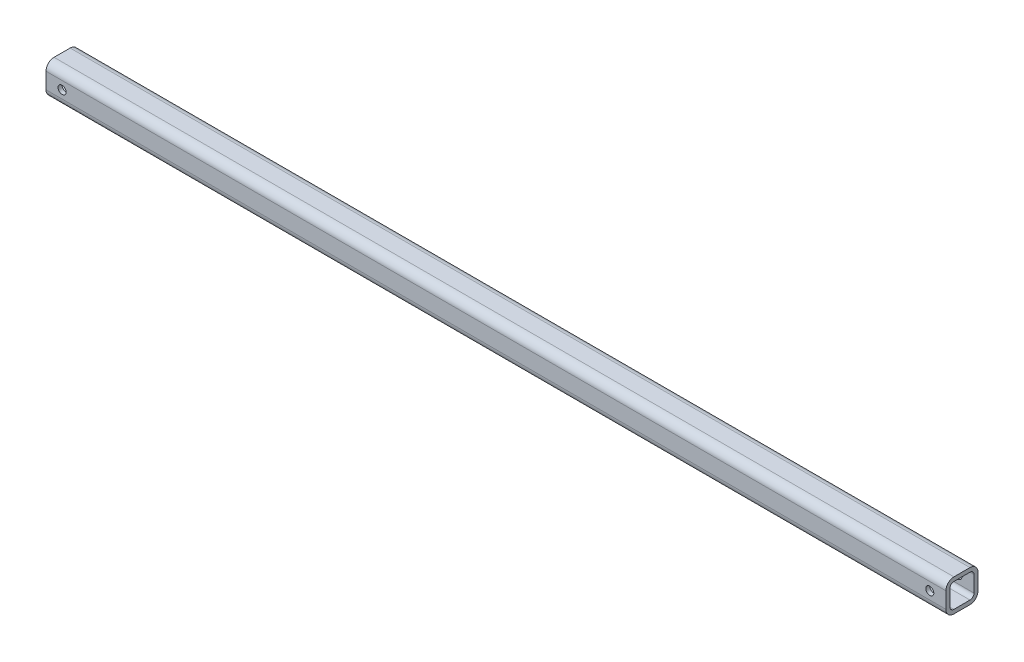
ISO-10303-21;
HEADER;
FILE_DESCRIPTION(('STEP AP214'),'2;1');
FILE_NAME('part.step','',(''),(''),'','','');
FILE_SCHEMA(('AUTOMOTIVE_DESIGN { 1 0 10303 214 1 1 1 1 }'));
ENDSEC;
DATA;
#1=APPLICATION_CONTEXT('core data for automotive mechanical design processes');
#2=APPLICATION_PROTOCOL_DEFINITION('international standard','automotive_design',2000,#1);
#3=PRODUCT_CONTEXT('',#1,'mechanical');
#4=PRODUCT('Part','Part','',(#3));
#5=PRODUCT_RELATED_PRODUCT_CATEGORY('part','',(#4));
#6=PRODUCT_DEFINITION_FORMATION('','',#4);
#7=PRODUCT_DEFINITION_CONTEXT('part definition',#1,'design');
#8=PRODUCT_DEFINITION('design','',#6,#7);
#9=PRODUCT_DEFINITION_SHAPE('','',#8);
#10=(LENGTH_UNIT() NAMED_UNIT(*) SI_UNIT(.MILLI.,.METRE.));
#11=(NAMED_UNIT(*) PLANE_ANGLE_UNIT() SI_UNIT($,.RADIAN.));
#12=(NAMED_UNIT(*) SI_UNIT($,.STERADIAN.) SOLID_ANGLE_UNIT());
#13=UNCERTAINTY_MEASURE_WITH_UNIT(LENGTH_MEASURE(1.E-05),#10,'distance_accuracy_value','');
#14=(GEOMETRIC_REPRESENTATION_CONTEXT(3) GLOBAL_UNCERTAINTY_ASSIGNED_CONTEXT((#13)) GLOBAL_UNIT_ASSIGNED_CONTEXT((#10,
#11,#12)) REPRESENTATION_CONTEXT('',''));
#15=CARTESIAN_POINT('',(0.,0.,0.));
#16=DIRECTION('',(0.,0.,1.));
#17=DIRECTION('',(1.,0.,0.));
#18=AXIS2_PLACEMENT_3D('',#15,#16,#17);
#19=CARTESIAN_POINT('',(680.806837606838,12.7,12.7));
#20=DIRECTION('',(-1.,0.,0.));
#21=DIRECTION('',(0.,0.,1.));
#22=AXIS2_PLACEMENT_3D('',#19,#20,#21);
#23=CYLINDRICAL_SURFACE('',#22,12.7);
#24=CARTESIAN_POINT('',(-741.593162393162,12.7,12.7));
#25=DIRECTION('',(1.,0.,0.));
#26=DIRECTION('',(0.,0.,-1.));
#27=AXIS2_PLACEMENT_3D('',#24,#25,#26);
#28=CIRCLE('',#27,12.7);
#29=CARTESIAN_POINT('',(-741.593162393162,25.4,12.7));
#30=VERTEX_POINT('',#29);
#31=CARTESIAN_POINT('',(-741.593162393162,12.7,25.4));
#32=VERTEX_POINT('',#31);
#33=EDGE_CURVE('E235',#30,#32,#28,.T.);
#34=ORIENTED_EDGE('',*,*,#33,.T.);
#35=DIRECTION('',(-1.,0.,0.));
#36=VECTOR('',#35,1.);
#37=CARTESIAN_POINT('',(680.806837606838,12.7,25.4));
#38=LINE('',#37,#36);
#39=CARTESIAN_POINT('',(680.806837606838,12.7,25.4));
#40=VERTEX_POINT('',#39);
#41=EDGE_CURVE('E12',#40,#32,#38,.T.);
#42=ORIENTED_EDGE('',*,*,#41,.F.);
#43=CARTESIAN_POINT('',(680.806837606838,12.7,12.7));
#44=DIRECTION('',(1.,0.,0.));
#45=DIRECTION('',(0.,0.,-1.));
#46=AXIS2_PLACEMENT_3D('',#43,#44,#45);
#47=CIRCLE('',#46,12.7);
#48=CARTESIAN_POINT('',(680.806837606838,25.4,12.7));
#49=VERTEX_POINT('',#48);
#50=EDGE_CURVE('E315',#49,#40,#47,.T.);
#51=ORIENTED_EDGE('',*,*,#50,.F.);
#52=DIRECTION('',(-1.,0.,0.));
#53=VECTOR('',#52,1.);
#54=CARTESIAN_POINT('',(680.806837606838,25.4,12.7));
#55=LINE('',#54,#53);
#56=EDGE_CURVE('E250',#49,#30,#55,.T.);
#57=ORIENTED_EDGE('',*,*,#56,.T.);
#58=EDGE_LOOP('',(#34,#42,#51,#57));
#59=FACE_BOUND('',#58,.T.);
#60=ADVANCED_FACE('F61',(#59),#23,.T.);
#61=CARTESIAN_POINT('',(680.806837606838,12.7,25.4));
#62=DIRECTION('',(0.,0.,-1.));
#63=DIRECTION('',(-1.,0.,0.));
#64=AXIS2_PLACEMENT_3D('',#61,#62,#63);
#65=PLANE('',#64);
#66=CARTESIAN_POINT('',(655.406837606838,0.,25.4));
#67=DIRECTION('',(0.,0.,1.));
#68=DIRECTION('',(-1.,0.,0.));
#69=AXIS2_PLACEMENT_3D('',#66,#67,#68);
#70=CIRCLE('',#69,6.34999999999994);
#71=CARTESIAN_POINT('',(649.056837606838,0.,25.4));
#72=VERTEX_POINT('',#71);
#73=EDGE_CURVE('E435',#72,#72,#70,.T.);
#74=ORIENTED_EDGE('',*,*,#73,.F.);
#75=EDGE_LOOP('',(#74));
#76=FACE_BOUND('',#75,.T.);
#77=CARTESIAN_POINT('',(-716.193162393162,0.,25.4));
#78=DIRECTION('',(0.,0.,1.));
#79=DIRECTION('',(1.,0.,0.));
#80=AXIS2_PLACEMENT_3D('',#77,#78,#79);
#81=CIRCLE('',#80,6.34999999999994);
#82=CARTESIAN_POINT('',(-709.843162393162,0.,25.4));
#83=VERTEX_POINT('',#82);
#84=EDGE_CURVE('E283',#83,#83,#81,.T.);
#85=ORIENTED_EDGE('',*,*,#84,.F.);
#86=EDGE_LOOP('',(#85));
#87=FACE_BOUND('',#86,.T.);
#88=DIRECTION('',(0.,-1.,0.));
#89=VECTOR('',#88,1.);
#90=CARTESIAN_POINT('',(-741.593162393162,12.7,25.4));
#91=LINE('',#90,#89);
#92=CARTESIAN_POINT('',(-741.593162393162,-12.7,25.4));
#93=VERTEX_POINT('',#92);
#94=EDGE_CURVE('E238',#32,#93,#91,.T.);
#95=ORIENTED_EDGE('',*,*,#94,.T.);
#96=DIRECTION('',(-1.,0.,0.));
#97=VECTOR('',#96,1.);
#98=CARTESIAN_POINT('',(680.806837606838,-12.7,25.4));
#99=LINE('',#98,#97);
#100=CARTESIAN_POINT('',(680.806837606838,-12.7,25.4));
#101=VERTEX_POINT('',#100);
#102=EDGE_CURVE('E71',#101,#93,#99,.T.);
#103=ORIENTED_EDGE('',*,*,#102,.F.);
#104=DIRECTION('',(0.,-1.,0.));
#105=VECTOR('',#104,1.);
#106=CARTESIAN_POINT('',(680.806837606838,12.7,25.4));
#107=LINE('',#106,#105);
#108=EDGE_CURVE('E317',#40,#101,#107,.T.);
#109=ORIENTED_EDGE('',*,*,#108,.F.);
#110=ORIENTED_EDGE('',*,*,#41,.T.);
#111=EDGE_LOOP('',(#95,#103,#109,#110));
#112=FACE_BOUND('',#111,.T.);
#113=ADVANCED_FACE('F355',(#76,#87,#112),#65,.F.);
#114=CARTESIAN_POINT('',(680.806837606838,-12.7,12.7));
#115=DIRECTION('',(-1.,0.,0.));
#116=DIRECTION('',(0.,0.,1.));
#117=AXIS2_PLACEMENT_3D('',#114,#115,#116);
#118=CYLINDRICAL_SURFACE('',#117,12.7);
#119=CARTESIAN_POINT('',(-741.593162393162,-12.7,12.7));
#120=DIRECTION('',(1.,0.,0.));
#121=DIRECTION('',(0.,0.,-1.));
#122=AXIS2_PLACEMENT_3D('',#119,#120,#121);
#123=CIRCLE('',#122,12.7);
#124=CARTESIAN_POINT('',(-741.593162393162,-25.4,12.7));
#125=VERTEX_POINT('',#124);
#126=EDGE_CURVE('E240',#93,#125,#123,.T.);
#127=ORIENTED_EDGE('',*,*,#126,.T.);
#128=DIRECTION('',(-1.,0.,0.));
#129=VECTOR('',#128,1.);
#130=CARTESIAN_POINT('',(680.806837606838,-25.4,12.7));
#131=LINE('',#130,#129);
#132=CARTESIAN_POINT('',(680.806837606838,-25.4,12.7));
#133=VERTEX_POINT('',#132);
#134=EDGE_CURVE('E257',#133,#125,#131,.T.);
#135=ORIENTED_EDGE('',*,*,#134,.F.);
#136=CARTESIAN_POINT('',(680.806837606838,-12.7,12.7));
#137=DIRECTION('',(1.,0.,0.));
#138=DIRECTION('',(0.,0.,-1.));
#139=AXIS2_PLACEMENT_3D('',#136,#137,#138);
#140=CIRCLE('',#139,12.7);
#141=EDGE_CURVE('E319',#101,#133,#140,.T.);
#142=ORIENTED_EDGE('',*,*,#141,.F.);
#143=ORIENTED_EDGE('',*,*,#102,.T.);
#144=EDGE_LOOP('',(#127,#135,#142,#143));
#145=FACE_BOUND('',#144,.T.);
#146=ADVANCED_FACE('F360',(#145),#118,.T.);
#147=CARTESIAN_POINT('',(680.806837606838,-25.4,-12.7));
#148=DIRECTION('',(0.,1.,0.));
#149=DIRECTION('',(0.,0.,1.));
#150=AXIS2_PLACEMENT_3D('',#147,#148,#149);
#151=PLANE('',#150);
#152=DIRECTION('',(0.,0.,-1.));
#153=VECTOR('',#152,1.);
#154=CARTESIAN_POINT('',(-741.593162393162,-25.4,-12.7));
#155=LINE('',#154,#153);
#156=CARTESIAN_POINT('',(-741.593162393162,-25.4,-12.7));
#157=VERTEX_POINT('',#156);
#158=EDGE_CURVE('E242',#125,#157,#155,.T.);
#159=ORIENTED_EDGE('',*,*,#158,.T.);
#160=DIRECTION('',(-1.,0.,0.));
#161=VECTOR('',#160,1.);
#162=CARTESIAN_POINT('',(680.806837606838,-25.4,-12.7));
#163=LINE('',#162,#161);
#164=CARTESIAN_POINT('',(680.806837606838,-25.4,-12.7));
#165=VERTEX_POINT('',#164);
#166=EDGE_CURVE('E254',#165,#157,#163,.T.);
#167=ORIENTED_EDGE('',*,*,#166,.F.);
#168=DIRECTION('',(0.,0.,-1.));
#169=VECTOR('',#168,1.);
#170=CARTESIAN_POINT('',(680.806837606838,-25.4,-12.7));
#171=LINE('',#170,#169);
#172=EDGE_CURVE('E321',#133,#165,#171,.T.);
#173=ORIENTED_EDGE('',*,*,#172,.F.);
#174=ORIENTED_EDGE('',*,*,#134,.T.);
#175=EDGE_LOOP('',(#159,#167,#173,#174));
#176=FACE_BOUND('',#175,.T.);
#177=ADVANCED_FACE('F327',(#176),#151,.F.);
#178=CARTESIAN_POINT('',(680.806837606838,-12.7,-12.7));
#179=DIRECTION('',(-1.,0.,0.));
#180=DIRECTION('',(0.,0.,1.));
#181=AXIS2_PLACEMENT_3D('',#178,#179,#180);
#182=CYLINDRICAL_SURFACE('',#181,12.7);
#183=CARTESIAN_POINT('',(-741.593162393162,-12.7,-12.7));
#184=DIRECTION('',(1.,0.,0.));
#185=DIRECTION('',(0.,0.,-1.));
#186=AXIS2_PLACEMENT_3D('',#183,#184,#185);
#187=CIRCLE('',#186,12.7);
#188=CARTESIAN_POINT('',(-741.593162393162,-12.7,-25.4));
#189=VERTEX_POINT('',#188);
#190=EDGE_CURVE('E244',#157,#189,#187,.T.);
#191=ORIENTED_EDGE('',*,*,#190,.T.);
#192=DIRECTION('',(-1.,0.,0.));
#193=VECTOR('',#192,1.);
#194=CARTESIAN_POINT('',(680.806837606838,-12.7,-25.4));
#195=LINE('',#194,#193);
#196=CARTESIAN_POINT('',(680.806837606838,-12.7,-25.4));
#197=VERTEX_POINT('',#196);
#198=EDGE_CURVE('E201',#197,#189,#195,.T.);
#199=ORIENTED_EDGE('',*,*,#198,.F.);
#200=CARTESIAN_POINT('',(680.806837606838,-12.7,-12.7));
#201=DIRECTION('',(1.,0.,0.));
#202=DIRECTION('',(0.,0.,-1.));
#203=AXIS2_PLACEMENT_3D('',#200,#201,#202);
#204=CIRCLE('',#203,12.7);
#205=EDGE_CURVE('E192',#165,#197,#204,.T.);
#206=ORIENTED_EDGE('',*,*,#205,.F.);
#207=ORIENTED_EDGE('',*,*,#166,.T.);
#208=EDGE_LOOP('',(#191,#199,#206,#207));
#209=FACE_BOUND('',#208,.T.);
#210=ADVANCED_FACE('F331',(#209),#182,.T.);
#211=CARTESIAN_POINT('',(680.806837606838,-12.7,-25.4));
#212=DIRECTION('',(0.,0.,1.));
#213=DIRECTION('',(1.,0.,0.));
#214=AXIS2_PLACEMENT_3D('',#211,#212,#213);
#215=PLANE('',#214);
#216=CARTESIAN_POINT('',(655.406837606838,0.,-25.4));
#217=DIRECTION('',(0.,0.,1.));
#218=DIRECTION('',(-1.,0.,0.));
#219=AXIS2_PLACEMENT_3D('',#216,#217,#218);
#220=CIRCLE('',#219,6.34999999999994);
#221=CARTESIAN_POINT('',(649.056837606838,0.,-25.4));
#222=VERTEX_POINT('',#221);
#223=EDGE_CURVE('E433',#222,#222,#220,.T.);
#224=ORIENTED_EDGE('',*,*,#223,.T.);
#225=EDGE_LOOP('',(#224));
#226=FACE_BOUND('',#225,.T.);
#227=CARTESIAN_POINT('',(-716.193162393162,0.,-25.4));
#228=DIRECTION('',(0.,0.,1.));
#229=DIRECTION('',(1.,0.,0.));
#230=AXIS2_PLACEMENT_3D('',#227,#228,#229);
#231=CIRCLE('',#230,6.34999999999994);
#232=CARTESIAN_POINT('',(-709.843162393162,0.,-25.4));
#233=VERTEX_POINT('',#232);
#234=EDGE_CURVE('E277',#233,#233,#231,.T.);
#235=ORIENTED_EDGE('',*,*,#234,.T.);
#236=EDGE_LOOP('',(#235));
#237=FACE_BOUND('',#236,.T.);
#238=DIRECTION('',(0.,1.,0.));
#239=VECTOR('',#238,1.);
#240=CARTESIAN_POINT('',(-741.593162393162,-12.7,-25.4));
#241=LINE('',#240,#239);
#242=CARTESIAN_POINT('',(-741.593162393162,12.7,-25.4));
#243=VERTEX_POINT('',#242);
#244=EDGE_CURVE('E200',#189,#243,#241,.T.);
#245=ORIENTED_EDGE('',*,*,#244,.T.);
#246=DIRECTION('',(-1.,0.,0.));
#247=VECTOR('',#246,1.);
#248=CARTESIAN_POINT('',(680.806837606838,12.7,-25.4));
#249=LINE('',#248,#247);
#250=CARTESIAN_POINT('',(680.806837606838,12.7,-25.4));
#251=VERTEX_POINT('',#250);
#252=EDGE_CURVE('E197',#251,#243,#249,.T.);
#253=ORIENTED_EDGE('',*,*,#252,.F.);
#254=DIRECTION('',(0.,1.,0.));
#255=VECTOR('',#254,1.);
#256=CARTESIAN_POINT('',(680.806837606838,-12.7,-25.4));
#257=LINE('',#256,#255);
#258=EDGE_CURVE('E186',#197,#251,#257,.T.);
#259=ORIENTED_EDGE('',*,*,#258,.F.);
#260=ORIENTED_EDGE('',*,*,#198,.T.);
#261=EDGE_LOOP('',(#245,#253,#259,#260));
#262=FACE_BOUND('',#261,.T.);
#263=ADVANCED_FACE('F198',(#226,#237,#262),#215,.F.);
#264=CARTESIAN_POINT('',(680.806837606838,12.7,-12.7));
#265=DIRECTION('',(-1.,0.,0.));
#266=DIRECTION('',(0.,0.,1.));
#267=AXIS2_PLACEMENT_3D('',#264,#265,#266);
#268=CYLINDRICAL_SURFACE('',#267,12.7);
#269=CARTESIAN_POINT('',(-741.593162393162,12.7,-12.7));
#270=DIRECTION('',(1.,0.,0.));
#271=DIRECTION('',(0.,0.,-1.));
#272=AXIS2_PLACEMENT_3D('',#269,#270,#271);
#273=CIRCLE('',#272,12.7);
#274=CARTESIAN_POINT('',(-741.593162393162,25.4,-12.7));
#275=VERTEX_POINT('',#274);
#276=EDGE_CURVE('E133',#243,#275,#273,.T.);
#277=ORIENTED_EDGE('',*,*,#276,.T.);
#278=DIRECTION('',(-1.,0.,0.));
#279=VECTOR('',#278,1.);
#280=CARTESIAN_POINT('',(680.806837606838,25.4,-12.7));
#281=LINE('',#280,#279);
#282=CARTESIAN_POINT('',(680.806837606838,25.4,-12.7));
#283=VERTEX_POINT('',#282);
#284=EDGE_CURVE('E202',#283,#275,#281,.T.);
#285=ORIENTED_EDGE('',*,*,#284,.F.);
#286=CARTESIAN_POINT('',(680.806837606838,12.7,-12.7));
#287=DIRECTION('',(1.,0.,0.));
#288=DIRECTION('',(0.,0.,-1.));
#289=AXIS2_PLACEMENT_3D('',#286,#287,#288);
#290=CIRCLE('',#289,12.7);
#291=EDGE_CURVE('E190',#251,#283,#290,.T.);
#292=ORIENTED_EDGE('',*,*,#291,.F.);
#293=ORIENTED_EDGE('',*,*,#252,.T.);
#294=EDGE_LOOP('',(#277,#285,#292,#293));
#295=FACE_BOUND('',#294,.T.);
#296=ADVANCED_FACE('F204',(#295),#268,.T.);
#297=CARTESIAN_POINT('',(680.806837606838,-12.7,12.7));
#298=DIRECTION('',(-1.,0.,0.));
#299=DIRECTION('',(0.,0.,1.));
#300=AXIS2_PLACEMENT_3D('',#297,#298,#299);
#301=CYLINDRICAL_SURFACE('',#300,6.35);
#302=CARTESIAN_POINT('',(-741.593162393162,-12.7,12.7));
#303=DIRECTION('',(1.,0.,0.));
#304=DIRECTION('',(0.,0.,-1.));
#305=AXIS2_PLACEMENT_3D('',#302,#303,#304);
#306=CIRCLE('',#305,6.35);
#307=CARTESIAN_POINT('',(-741.593162393162,-12.7,19.05));
#308=VERTEX_POINT('',#307);
#309=CARTESIAN_POINT('',(-741.593162393162,-19.05,12.7));
#310=VERTEX_POINT('',#309);
#311=EDGE_CURVE('E210',#308,#310,#306,.T.);
#312=ORIENTED_EDGE('',*,*,#311,.F.);
#313=DIRECTION('',(-1.,0.,0.));
#314=VECTOR('',#313,1.);
#315=CARTESIAN_POINT('',(680.806837606838,-12.7,19.05));
#316=LINE('',#315,#314);
#317=CARTESIAN_POINT('',(680.806837606838,-12.7,19.05));
#318=VERTEX_POINT('',#317);
#319=EDGE_CURVE('E147',#318,#308,#316,.T.);
#320=ORIENTED_EDGE('',*,*,#319,.F.);
#321=CARTESIAN_POINT('',(680.806837606838,-12.7,12.7));
#322=DIRECTION('',(1.,0.,0.));
#323=DIRECTION('',(0.,0.,-1.));
#324=AXIS2_PLACEMENT_3D('',#321,#322,#323);
#325=CIRCLE('',#324,6.35);
#326=CARTESIAN_POINT('',(680.806837606838,-19.05,12.7));
#327=VERTEX_POINT('',#326);
#328=EDGE_CURVE('E249',#318,#327,#325,.T.);
#329=ORIENTED_EDGE('',*,*,#328,.T.);
#330=DIRECTION('',(-1.,0.,0.));
#331=VECTOR('',#330,1.);
#332=CARTESIAN_POINT('',(680.806837606838,-19.05,12.7));
#333=LINE('',#332,#331);
#334=EDGE_CURVE('E206',#327,#310,#333,.T.);
#335=ORIENTED_EDGE('',*,*,#334,.T.);
#336=EDGE_LOOP('',(#312,#320,#329,#335));
#337=FACE_BOUND('',#336,.T.);
#338=ADVANCED_FACE('F63',(#337),#301,.F.);
#339=CARTESIAN_POINT('',(680.806837606838,12.7,19.05));
#340=DIRECTION('',(0.,0.,-1.));
#341=DIRECTION('',(-1.,0.,0.));
#342=AXIS2_PLACEMENT_3D('',#339,#340,#341);
#343=PLANE('',#342);
#344=CARTESIAN_POINT('',(655.406837606838,0.,19.05));
#345=DIRECTION('',(0.,0.,-1.));
#346=DIRECTION('',(-1.,0.,0.));
#347=AXIS2_PLACEMENT_3D('',#344,#345,#346);
#348=CIRCLE('',#347,6.34999999999994);
#349=CARTESIAN_POINT('',(649.056837606838,0.,19.05));
#350=VERTEX_POINT('',#349);
#351=EDGE_CURVE('E288',#350,#350,#348,.T.);
#352=ORIENTED_EDGE('',*,*,#351,.F.);
#353=EDGE_LOOP('',(#352));
#354=FACE_BOUND('',#353,.T.);
#355=CARTESIAN_POINT('',(-716.193162393162,0.,19.05));
#356=DIRECTION('',(0.,0.,-1.));
#357=DIRECTION('',(-1.,0.,0.));
#358=AXIS2_PLACEMENT_3D('',#355,#356,#357);
#359=CIRCLE('',#358,6.34999999999994);
#360=CARTESIAN_POINT('',(-722.543162393162,0.,19.05));
#361=VERTEX_POINT('',#360);
#362=EDGE_CURVE('E214',#361,#361,#359,.T.);
#363=ORIENTED_EDGE('',*,*,#362,.F.);
#364=EDGE_LOOP('',(#363));
#365=FACE_BOUND('',#364,.T.);
#366=DIRECTION('',(0.,-1.,0.));
#367=VECTOR('',#366,1.);
#368=CARTESIAN_POINT('',(-741.593162393162,12.7,19.05));
#369=LINE('',#368,#367);
#370=CARTESIAN_POINT('',(-741.593162393162,12.7,19.05));
#371=VERTEX_POINT('',#370);
#372=EDGE_CURVE('E213',#371,#308,#369,.T.);
#373=ORIENTED_EDGE('',*,*,#372,.F.);
#374=DIRECTION('',(-1.,0.,0.));
#375=VECTOR('',#374,1.);
#376=CARTESIAN_POINT('',(680.806837606838,12.7,19.05));
#377=LINE('',#376,#375);
#378=CARTESIAN_POINT('',(680.806837606838,12.7,19.05));
#379=VERTEX_POINT('',#378);
#380=EDGE_CURVE('E273',#379,#371,#377,.T.);
#381=ORIENTED_EDGE('',*,*,#380,.F.);
#382=DIRECTION('',(0.,-1.,0.));
#383=VECTOR('',#382,1.);
#384=CARTESIAN_POINT('',(680.806837606838,12.7,19.05));
#385=LINE('',#384,#383);
#386=EDGE_CURVE('E294',#379,#318,#385,.T.);
#387=ORIENTED_EDGE('',*,*,#386,.T.);
#388=ORIENTED_EDGE('',*,*,#319,.T.);
#389=EDGE_LOOP('',(#373,#381,#387,#388));
#390=FACE_BOUND('',#389,.T.);
#391=ADVANCED_FACE('F382',(#354,#365,#390),#343,.T.);
#392=CARTESIAN_POINT('',(680.806837606838,12.7,12.7));
#393=DIRECTION('',(-1.,0.,0.));
#394=DIRECTION('',(0.,0.,1.));
#395=AXIS2_PLACEMENT_3D('',#392,#393,#394);
#396=CYLINDRICAL_SURFACE('',#395,6.35);
#397=CARTESIAN_POINT('',(-741.593162393162,12.7,12.7));
#398=DIRECTION('',(1.,0.,0.));
#399=DIRECTION('',(0.,0.,-1.));
#400=AXIS2_PLACEMENT_3D('',#397,#398,#399);
#401=CIRCLE('',#400,6.35);
#402=CARTESIAN_POINT('',(-741.593162393162,19.05,12.7));
#403=VERTEX_POINT('',#402);
#404=EDGE_CURVE('E217',#403,#371,#401,.T.);
#405=ORIENTED_EDGE('',*,*,#404,.F.);
#406=DIRECTION('',(-1.,0.,0.));
#407=VECTOR('',#406,1.);
#408=CARTESIAN_POINT('',(680.806837606838,19.05,12.7));
#409=LINE('',#408,#407);
#410=CARTESIAN_POINT('',(680.806837606838,19.05,12.7));
#411=VERTEX_POINT('',#410);
#412=EDGE_CURVE('E271',#411,#403,#409,.T.);
#413=ORIENTED_EDGE('',*,*,#412,.F.);
#414=CARTESIAN_POINT('',(680.806837606838,12.7,12.7));
#415=DIRECTION('',(1.,0.,0.));
#416=DIRECTION('',(0.,0.,-1.));
#417=AXIS2_PLACEMENT_3D('',#414,#415,#416);
#418=CIRCLE('',#417,6.35);
#419=EDGE_CURVE('E297',#411,#379,#418,.T.);
#420=ORIENTED_EDGE('',*,*,#419,.T.);
#421=ORIENTED_EDGE('',*,*,#380,.T.);
#422=EDGE_LOOP('',(#405,#413,#420,#421));
#423=FACE_BOUND('',#422,.T.);
#424=ADVANCED_FACE('F379',(#423),#396,.F.);
#425=CARTESIAN_POINT('',(680.806837606838,19.05,12.7));
#426=DIRECTION('',(0.,-1.,0.));
#427=DIRECTION('',(0.,0.,-1.));
#428=AXIS2_PLACEMENT_3D('',#425,#426,#427);
#429=PLANE('',#428);
#430=DIRECTION('',(0.,0.,1.));
#431=VECTOR('',#430,1.);
#432=CARTESIAN_POINT('',(-741.593162393162,19.05,12.7));
#433=LINE('',#432,#431);
#434=CARTESIAN_POINT('',(-741.593162393162,19.05,-12.7));
#435=VERTEX_POINT('',#434);
#436=EDGE_CURVE('E220',#435,#403,#433,.T.);
#437=ORIENTED_EDGE('',*,*,#436,.F.);
#438=DIRECTION('',(-1.,0.,0.));
#439=VECTOR('',#438,1.);
#440=CARTESIAN_POINT('',(680.806837606838,19.05,-12.7));
#441=LINE('',#440,#439);
#442=CARTESIAN_POINT('',(680.806837606838,19.05,-12.7));
#443=VERTEX_POINT('',#442);
#444=EDGE_CURVE('E269',#443,#435,#441,.T.);
#445=ORIENTED_EDGE('',*,*,#444,.F.);
#446=DIRECTION('',(0.,0.,1.));
#447=VECTOR('',#446,1.);
#448=CARTESIAN_POINT('',(680.806837606838,19.05,12.7));
#449=LINE('',#448,#447);
#450=EDGE_CURVE('E300',#443,#411,#449,.T.);
#451=ORIENTED_EDGE('',*,*,#450,.T.);
#452=ORIENTED_EDGE('',*,*,#412,.T.);
#453=EDGE_LOOP('',(#437,#445,#451,#452));
#454=FACE_BOUND('',#453,.T.);
#455=ADVANCED_FACE('F375',(#454),#429,.T.);
#456=CARTESIAN_POINT('',(680.806837606838,12.7,-12.7));
#457=DIRECTION('',(-1.,0.,0.));
#458=DIRECTION('',(0.,0.,1.));
#459=AXIS2_PLACEMENT_3D('',#456,#457,#458);
#460=CYLINDRICAL_SURFACE('',#459,6.35);
#461=CARTESIAN_POINT('',(-741.593162393162,12.7,-12.7));
#462=DIRECTION('',(1.,0.,0.));
#463=DIRECTION('',(0.,0.,-1.));
#464=AXIS2_PLACEMENT_3D('',#461,#462,#463);
#465=CIRCLE('',#464,6.35);
#466=CARTESIAN_POINT('',(-741.593162393162,12.7,-19.05));
#467=VERTEX_POINT('',#466);
#468=EDGE_CURVE('E223',#467,#435,#465,.T.);
#469=ORIENTED_EDGE('',*,*,#468,.F.);
#470=DIRECTION('',(-1.,0.,0.));
#471=VECTOR('',#470,1.);
#472=CARTESIAN_POINT('',(680.806837606838,12.7,-19.05));
#473=LINE('',#472,#471);
#474=CARTESIAN_POINT('',(680.806837606838,12.7,-19.05));
#475=VERTEX_POINT('',#474);
#476=EDGE_CURVE('E267',#475,#467,#473,.T.);
#477=ORIENTED_EDGE('',*,*,#476,.F.);
#478=CARTESIAN_POINT('',(680.806837606838,12.7,-12.7));
#479=DIRECTION('',(1.,0.,0.));
#480=DIRECTION('',(0.,0.,-1.));
#481=AXIS2_PLACEMENT_3D('',#478,#479,#480);
#482=CIRCLE('',#481,6.35);
#483=EDGE_CURVE('E303',#475,#443,#482,.T.);
#484=ORIENTED_EDGE('',*,*,#483,.T.);
#485=ORIENTED_EDGE('',*,*,#444,.T.);
#486=EDGE_LOOP('',(#469,#477,#484,#485));
#487=FACE_BOUND('',#486,.T.);
#488=ADVANCED_FACE('F371',(#487),#460,.F.);
#489=CARTESIAN_POINT('',(680.806837606838,-12.7,-19.05));
#490=DIRECTION('',(0.,0.,1.));
#491=DIRECTION('',(1.,0.,0.));
#492=AXIS2_PLACEMENT_3D('',#489,#490,#491);
#493=PLANE('',#492);
#494=CARTESIAN_POINT('',(655.406837606838,0.,-19.05));
#495=DIRECTION('',(0.,0.,1.));
#496=DIRECTION('',(1.,0.,0.));
#497=AXIS2_PLACEMENT_3D('',#494,#495,#496);
#498=CIRCLE('',#497,6.34999999999994);
#499=CARTESIAN_POINT('',(661.756837606838,0.,-19.05));
#500=VERTEX_POINT('',#499);
#501=EDGE_CURVE('E65',#500,#500,#498,.T.);
#502=ORIENTED_EDGE('',*,*,#501,.F.);
#503=EDGE_LOOP('',(#502));
#504=FACE_BOUND('',#503,.T.);
#505=CARTESIAN_POINT('',(-716.193162393162,0.,-19.05));
#506=DIRECTION('',(0.,0.,1.));
#507=DIRECTION('',(1.,0.,0.));
#508=AXIS2_PLACEMENT_3D('',#505,#506,#507);
#509=CIRCLE('',#508,6.34999999999994);
#510=CARTESIAN_POINT('',(-709.843162393162,0.,-19.05));
#511=VERTEX_POINT('',#510);
#512=EDGE_CURVE('E275',#511,#511,#509,.T.);
#513=ORIENTED_EDGE('',*,*,#512,.F.);
#514=EDGE_LOOP('',(#513));
#515=FACE_BOUND('',#514,.T.);
#516=DIRECTION('',(0.,1.,0.));
#517=VECTOR('',#516,1.);
#518=CARTESIAN_POINT('',(-741.593162393162,-12.7,-19.05));
#519=LINE('',#518,#517);
#520=CARTESIAN_POINT('',(-741.593162393162,-12.7,-19.05));
#521=VERTEX_POINT('',#520);
#522=EDGE_CURVE('E226',#521,#467,#519,.T.);
#523=ORIENTED_EDGE('',*,*,#522,.F.);
#524=DIRECTION('',(-1.,0.,0.));
#525=VECTOR('',#524,1.);
#526=CARTESIAN_POINT('',(680.806837606838,-12.7,-19.05));
#527=LINE('',#526,#525);
#528=CARTESIAN_POINT('',(680.806837606838,-12.7,-19.05));
#529=VERTEX_POINT('',#528);
#530=EDGE_CURVE('E265',#529,#521,#527,.T.);
#531=ORIENTED_EDGE('',*,*,#530,.F.);
#532=DIRECTION('',(0.,1.,0.));
#533=VECTOR('',#532,1.);
#534=CARTESIAN_POINT('',(680.806837606838,-12.7,-19.05));
#535=LINE('',#534,#533);
#536=EDGE_CURVE('E306',#529,#475,#535,.T.);
#537=ORIENTED_EDGE('',*,*,#536,.T.);
#538=ORIENTED_EDGE('',*,*,#476,.T.);
#539=EDGE_LOOP('',(#523,#531,#537,#538));
#540=FACE_BOUND('',#539,.T.);
#541=ADVANCED_FACE('F367',(#504,#515,#540),#493,.T.);
#542=CARTESIAN_POINT('',(680.806837606838,-12.7,-12.7));
#543=DIRECTION('',(-1.,0.,0.));
#544=DIRECTION('',(0.,0.,1.));
#545=AXIS2_PLACEMENT_3D('',#542,#543,#544);
#546=CYLINDRICAL_SURFACE('',#545,6.35);
#547=CARTESIAN_POINT('',(-741.593162393162,-12.7,-12.7));
#548=DIRECTION('',(1.,0.,0.));
#549=DIRECTION('',(0.,0.,-1.));
#550=AXIS2_PLACEMENT_3D('',#547,#548,#549);
#551=CIRCLE('',#550,6.35);
#552=CARTESIAN_POINT('',(-741.593162393162,-19.05,-12.7));
#553=VERTEX_POINT('',#552);
#554=EDGE_CURVE('E229',#553,#521,#551,.T.);
#555=ORIENTED_EDGE('',*,*,#554,.F.);
#556=DIRECTION('',(-1.,0.,0.));
#557=VECTOR('',#556,1.);
#558=CARTESIAN_POINT('',(680.806837606838,-19.05,-12.7));
#559=LINE('',#558,#557);
#560=CARTESIAN_POINT('',(680.806837606838,-19.05,-12.7));
#561=VERTEX_POINT('',#560);
#562=EDGE_CURVE('E263',#561,#553,#559,.T.);
#563=ORIENTED_EDGE('',*,*,#562,.F.);
#564=CARTESIAN_POINT('',(680.806837606838,-12.7,-12.7));
#565=DIRECTION('',(1.,0.,0.));
#566=DIRECTION('',(0.,0.,-1.));
#567=AXIS2_PLACEMENT_3D('',#564,#565,#566);
#568=CIRCLE('',#567,6.35);
#569=EDGE_CURVE('E309',#561,#529,#568,.T.);
#570=ORIENTED_EDGE('',*,*,#569,.T.);
#571=ORIENTED_EDGE('',*,*,#530,.T.);
#572=EDGE_LOOP('',(#555,#563,#570,#571));
#573=FACE_BOUND('',#572,.T.);
#574=ADVANCED_FACE('F349',(#573),#546,.F.);
#575=CARTESIAN_POINT('',(680.806837606838,-19.05,-12.7));
#576=DIRECTION('',(0.,1.,0.));
#577=DIRECTION('',(0.,0.,1.));
#578=AXIS2_PLACEMENT_3D('',#575,#576,#577);
#579=PLANE('',#578);
#580=DIRECTION('',(0.,0.,-1.));
#581=VECTOR('',#580,1.);
#582=CARTESIAN_POINT('',(-741.593162393162,-19.05,-12.7));
#583=LINE('',#582,#581);
#584=EDGE_CURVE('E232',#310,#553,#583,.T.);
#585=ORIENTED_EDGE('',*,*,#584,.F.);
#586=ORIENTED_EDGE('',*,*,#334,.F.);
#587=DIRECTION('',(0.,0.,-1.));
#588=VECTOR('',#587,1.);
#589=CARTESIAN_POINT('',(680.806837606838,-19.05,-12.7));
#590=LINE('',#589,#588);
#591=EDGE_CURVE('E312',#327,#561,#590,.T.);
#592=ORIENTED_EDGE('',*,*,#591,.T.);
#593=ORIENTED_EDGE('',*,*,#562,.T.);
#594=EDGE_LOOP('',(#585,#586,#592,#593));
#595=FACE_BOUND('',#594,.T.);
#596=ADVANCED_FACE('F341',(#595),#579,.T.);
#597=CARTESIAN_POINT('',(680.806837606838,25.4,12.7));
#598=DIRECTION('',(0.,-1.,0.));
#599=DIRECTION('',(0.,0.,-1.));
#600=AXIS2_PLACEMENT_3D('',#597,#598,#599);
#601=PLANE('',#600);
#602=DIRECTION('',(0.,0.,1.));
#603=VECTOR('',#602,1.);
#604=CARTESIAN_POINT('',(-741.593162393162,25.4,12.7));
#605=LINE('',#604,#603);
#606=EDGE_CURVE('E139',#275,#30,#605,.T.);
#607=ORIENTED_EDGE('',*,*,#606,.T.);
#608=ORIENTED_EDGE('',*,*,#56,.F.);
#609=DIRECTION('',(0.,0.,1.));
#610=VECTOR('',#609,1.);
#611=CARTESIAN_POINT('',(680.806837606838,25.4,12.7));
#612=LINE('',#611,#610);
#613=EDGE_CURVE('E80',#283,#49,#612,.T.);
#614=ORIENTED_EDGE('',*,*,#613,.F.);
#615=ORIENTED_EDGE('',*,*,#284,.T.);
#616=EDGE_LOOP('',(#607,#608,#614,#615));
#617=FACE_BOUND('',#616,.T.);
#618=ADVANCED_FACE('F339',(#617),#601,.F.);
#619=CARTESIAN_POINT('',(680.806837606838,12.7,12.7));
#620=DIRECTION('',(1.,0.,0.));
#621=DIRECTION('',(0.,0.,-1.));
#622=AXIS2_PLACEMENT_3D('',#619,#620,#621);
#623=PLANE('',#622);
#624=ORIENTED_EDGE('',*,*,#328,.F.);
#625=ORIENTED_EDGE('',*,*,#386,.F.);
#626=ORIENTED_EDGE('',*,*,#419,.F.);
#627=ORIENTED_EDGE('',*,*,#450,.F.);
#628=ORIENTED_EDGE('',*,*,#483,.F.);
#629=ORIENTED_EDGE('',*,*,#536,.F.);
#630=ORIENTED_EDGE('',*,*,#569,.F.);
#631=ORIENTED_EDGE('',*,*,#591,.F.);
#632=EDGE_LOOP('',(#624,#625,#626,#627,#628,#629,#630,#631));
#633=FACE_BOUND('',#632,.T.);
#634=ORIENTED_EDGE('',*,*,#50,.T.);
#635=ORIENTED_EDGE('',*,*,#108,.T.);
#636=ORIENTED_EDGE('',*,*,#141,.T.);
#637=ORIENTED_EDGE('',*,*,#172,.T.);
#638=ORIENTED_EDGE('',*,*,#205,.T.);
#639=ORIENTED_EDGE('',*,*,#258,.T.);
#640=ORIENTED_EDGE('',*,*,#291,.T.);
#641=ORIENTED_EDGE('',*,*,#613,.T.);
#642=EDGE_LOOP('',(#634,#635,#636,#637,#638,#639,#640,#641));
#643=FACE_BOUND('',#642,.T.);
#644=ADVANCED_FACE('F188',(#633,#643),#623,.T.);
#645=CARTESIAN_POINT('',(-741.593162393162,12.7,12.7));
#646=DIRECTION('',(1.,0.,0.));
#647=DIRECTION('',(0.,0.,-1.));
#648=AXIS2_PLACEMENT_3D('',#645,#646,#647);
#649=PLANE('',#648);
#650=ORIENTED_EDGE('',*,*,#311,.T.);
#651=ORIENTED_EDGE('',*,*,#584,.T.);
#652=ORIENTED_EDGE('',*,*,#554,.T.);
#653=ORIENTED_EDGE('',*,*,#522,.T.);
#654=ORIENTED_EDGE('',*,*,#468,.T.);
#655=ORIENTED_EDGE('',*,*,#436,.T.);
#656=ORIENTED_EDGE('',*,*,#404,.T.);
#657=ORIENTED_EDGE('',*,*,#372,.T.);
#658=EDGE_LOOP('',(#650,#651,#652,#653,#654,#655,#656,#657));
#659=FACE_BOUND('',#658,.T.);
#660=ORIENTED_EDGE('',*,*,#33,.F.);
#661=ORIENTED_EDGE('',*,*,#606,.F.);
#662=ORIENTED_EDGE('',*,*,#276,.F.);
#663=ORIENTED_EDGE('',*,*,#244,.F.);
#664=ORIENTED_EDGE('',*,*,#190,.F.);
#665=ORIENTED_EDGE('',*,*,#158,.F.);
#666=ORIENTED_EDGE('',*,*,#126,.F.);
#667=ORIENTED_EDGE('',*,*,#94,.F.);
#668=EDGE_LOOP('',(#660,#661,#662,#663,#664,#665,#666,#667));
#669=FACE_BOUND('',#668,.T.);
#670=ADVANCED_FACE('F334',(#659,#669),#649,.F.);
#671=CARTESIAN_POINT('',(-716.193162393162,0.,-25.4));
#672=DIRECTION('',(0.,0.,1.));
#673=DIRECTION('',(1.,0.,0.));
#674=AXIS2_PLACEMENT_3D('',#671,#672,#673);
#675=CYLINDRICAL_SURFACE('',#674,6.34999999999994);
#676=ORIENTED_EDGE('',*,*,#512,.T.);
#677=EDGE_LOOP('',(#676));
#678=FACE_BOUND('',#677,.T.);
#679=ORIENTED_EDGE('',*,*,#234,.F.);
#680=EDGE_LOOP('',(#679));
#681=FACE_BOUND('',#680,.T.);
#682=ADVANCED_FACE('F411',(#678,#681),#675,.F.);
#683=ORIENTED_EDGE('',*,*,#362,.T.);
#684=EDGE_LOOP('',(#683));
#685=FACE_BOUND('',#684,.T.);
#686=ORIENTED_EDGE('',*,*,#84,.T.);
#687=EDGE_LOOP('',(#686));
#688=FACE_BOUND('',#687,.T.);
#689=ADVANCED_FACE('F415',(#685,#688),#675,.F.);
#690=CARTESIAN_POINT('',(655.406837606838,0.,-25.4));
#691=DIRECTION('',(0.,0.,1.));
#692=DIRECTION('',(1.,0.,0.));
#693=AXIS2_PLACEMENT_3D('',#690,#691,#692);
#694=CYLINDRICAL_SURFACE('',#693,6.34999999999994);
#695=ORIENTED_EDGE('',*,*,#501,.T.);
#696=EDGE_LOOP('',(#695));
#697=FACE_BOUND('',#696,.T.);
#698=ORIENTED_EDGE('',*,*,#223,.F.);
#699=EDGE_LOOP('',(#698));
#700=FACE_BOUND('',#699,.T.);
#701=ADVANCED_FACE('F418',(#697,#700),#694,.F.);
#702=ORIENTED_EDGE('',*,*,#351,.T.);
#703=EDGE_LOOP('',(#702));
#704=FACE_BOUND('',#703,.T.);
#705=ORIENTED_EDGE('',*,*,#73,.T.);
#706=EDGE_LOOP('',(#705));
#707=FACE_BOUND('',#706,.T.);
#708=ADVANCED_FACE('F420',(#704,#707),#694,.F.);
#709=CLOSED_SHELL('',(#60,#113,#146,#177,#210,#263,#296,#338,#391,#424,#455,#488,#541,#574,#596,
#618,#644,#670,#682,#689,#701,#708));
#710=MANIFOLD_SOLID_BREP('B2',#709);
#711=ADVANCED_BREP_SHAPE_REPRESENTATION('',(#18,#710),#14);
#712=SHAPE_DEFINITION_REPRESENTATION(#9,#711);
ENDSEC;
END-ISO-10303-21;
